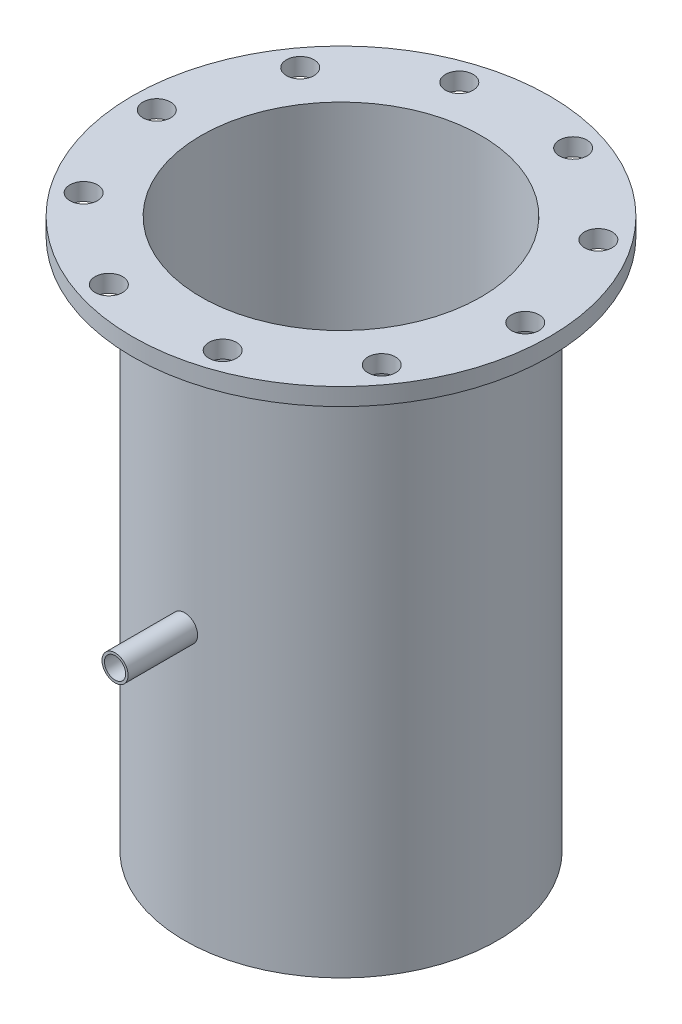
ISO-10303-21;
HEADER;
FILE_DESCRIPTION(('STEP AP214'),'2;1');
FILE_NAME('part.step','',(''),(''),'','','');
FILE_SCHEMA(('AUTOMOTIVE_DESIGN { 1 0 10303 214 1 1 1 1 }'));
ENDSEC;
DATA;
#1=APPLICATION_CONTEXT('core data for automotive mechanical design processes');
#2=APPLICATION_PROTOCOL_DEFINITION('international standard','automotive_design',2000,#1);
#3=PRODUCT_CONTEXT('',#1,'mechanical');
#4=PRODUCT('Part','Part','',(#3));
#5=PRODUCT_RELATED_PRODUCT_CATEGORY('part','',(#4));
#6=PRODUCT_DEFINITION_FORMATION('','',#4);
#7=PRODUCT_DEFINITION_CONTEXT('part definition',#1,'design');
#8=PRODUCT_DEFINITION('design','',#6,#7);
#9=PRODUCT_DEFINITION_SHAPE('','',#8);
#10=(LENGTH_UNIT() NAMED_UNIT(*) SI_UNIT(.MILLI.,.METRE.));
#11=(NAMED_UNIT(*) PLANE_ANGLE_UNIT() SI_UNIT($,.RADIAN.));
#12=(NAMED_UNIT(*) SI_UNIT($,.STERADIAN.) SOLID_ANGLE_UNIT());
#13=UNCERTAINTY_MEASURE_WITH_UNIT(LENGTH_MEASURE(1.E-05),#10,'distance_accuracy_value','');
#14=(GEOMETRIC_REPRESENTATION_CONTEXT(3) GLOBAL_UNCERTAINTY_ASSIGNED_CONTEXT((#13)) GLOBAL_UNIT_ASSIGNED_CONTEXT((#10,
#11,#12)) REPRESENTATION_CONTEXT('',''));
#15=CARTESIAN_POINT('',(0.,0.,0.));
#16=DIRECTION('',(0.,0.,1.));
#17=DIRECTION('',(1.,0.,0.));
#18=AXIS2_PLACEMENT_3D('',#15,#16,#17);
#19=CARTESIAN_POINT('',(0.,-101.6,82.5499999999989));
#20=DIRECTION('',(0.,0.,1.));
#21=DIRECTION('',(1.,0.,0.));
#22=AXIS2_PLACEMENT_3D('',#19,#20,#21);
#23=PLANE('',#22);
#24=CARTESIAN_POINT('',(0.,-101.6,82.5499999999989));
#25=DIRECTION('',(0.,0.,1.));
#26=DIRECTION('',(1.,0.,0.));
#27=AXIS2_PLACEMENT_3D('',#24,#25,#26);
#28=CIRCLE('',#27,4.76249999999999);
#29=CARTESIAN_POINT('',(4.76249999999999,-101.6,82.5499999999989));
#30=VERTEX_POINT('',#29);
#31=EDGE_CURVE('E11',#30,#30,#28,.T.);
#32=ORIENTED_EDGE('',*,*,#31,.T.);
#33=EDGE_LOOP('',(#32));
#34=FACE_BOUND('',#33,.T.);
#35=CARTESIAN_POINT('',(0.,-101.6,82.5499999999989));
#36=DIRECTION('',(0.,0.,1.));
#37=DIRECTION('',(1.,0.,0.));
#38=AXIS2_PLACEMENT_3D('',#35,#36,#37);
#39=CIRCLE('',#38,3.8735);
#40=CARTESIAN_POINT('',(3.8735,-101.6,82.5499999999989));
#41=VERTEX_POINT('',#40);
#42=EDGE_CURVE('E52',#41,#41,#39,.T.);
#43=ORIENTED_EDGE('',*,*,#42,.F.);
#44=EDGE_LOOP('',(#43));
#45=FACE_BOUND('',#44,.T.);
#46=ADVANCED_FACE('F41',(#34,#45),#23,.T.);
#47=CARTESIAN_POINT('',(0.,-101.6,57.1499999999989));
#48=DIRECTION('',(0.,0.,1.));
#49=DIRECTION('',(1.,0.,0.));
#50=AXIS2_PLACEMENT_3D('',#47,#48,#49);
#51=PLANE('',#50);
#52=CARTESIAN_POINT('',(0.,-101.6,57.1499999999989));
#53=DIRECTION('',(0.,0.,1.));
#54=DIRECTION('',(1.,0.,0.));
#55=AXIS2_PLACEMENT_3D('',#52,#53,#54);
#56=CIRCLE('',#55,4.76249999999999);
#57=CARTESIAN_POINT('',(4.76249999999999,-101.6,57.1499999999989));
#58=VERTEX_POINT('',#57);
#59=EDGE_CURVE('E45',#58,#58,#56,.T.);
#60=ORIENTED_EDGE('',*,*,#59,.F.);
#61=EDGE_LOOP('',(#60));
#62=FACE_BOUND('',#61,.T.);
#63=CARTESIAN_POINT('',(0.,-101.6,57.1499999999989));
#64=DIRECTION('',(0.,0.,1.));
#65=DIRECTION('',(1.,0.,0.));
#66=AXIS2_PLACEMENT_3D('',#63,#64,#65);
#67=CIRCLE('',#66,3.8735);
#68=CARTESIAN_POINT('',(3.8735,-101.6,57.1499999999989));
#69=VERTEX_POINT('',#68);
#70=EDGE_CURVE('E54',#69,#69,#67,.T.);
#71=ORIENTED_EDGE('',*,*,#70,.T.);
#72=EDGE_LOOP('',(#71));
#73=FACE_BOUND('',#72,.T.);
#74=ADVANCED_FACE('F64',(#62,#73),#51,.F.);
#75=CARTESIAN_POINT('',(0.,-101.6,82.5499999999989));
#76=DIRECTION('',(0.,0.,-1.));
#77=DIRECTION('',(-1.,0.,0.));
#78=AXIS2_PLACEMENT_3D('',#75,#76,#77);
#79=CYLINDRICAL_SURFACE('',#78,4.76249999999999);
#80=ORIENTED_EDGE('',*,*,#31,.F.);
#81=EDGE_LOOP('',(#80));
#82=FACE_BOUND('',#81,.T.);
#83=ORIENTED_EDGE('',*,*,#59,.T.);
#84=EDGE_LOOP('',(#83));
#85=FACE_BOUND('',#84,.T.);
#86=ADVANCED_FACE('F43',(#82,#85),#79,.T.);
#87=CARTESIAN_POINT('',(0.,-101.6,82.5499999999989));
#88=DIRECTION('',(0.,0.,-1.));
#89=DIRECTION('',(-1.,0.,0.));
#90=AXIS2_PLACEMENT_3D('',#87,#88,#89);
#91=CYLINDRICAL_SURFACE('',#90,3.8735);
#92=ORIENTED_EDGE('',*,*,#42,.T.);
#93=EDGE_LOOP('',(#92));
#94=FACE_BOUND('',#93,.T.);
#95=ORIENTED_EDGE('',*,*,#70,.F.);
#96=EDGE_LOOP('',(#95));
#97=FACE_BOUND('',#96,.T.);
#98=ADVANCED_FACE('F60',(#94,#97),#91,.F.);
#99=CLOSED_SHELL('',(#46,#74,#86,#98));
#100=MANIFOLD_SOLID_BREP('B2',#99);
#101=CARTESIAN_POINT('',(76.2,1.25806636316965E-13,0.));
#102=DIRECTION('',(0.,-1.,0.));
#103=DIRECTION('',(1.,0.,0.));
#104=AXIS2_PLACEMENT_3D('',#101,#102,#103);
#105=PLANE('',#104);
#106=CARTESIAN_POINT('',(20.7999338913784,2.16470374895981E-13,64.0156141118266));
#107=DIRECTION('',(0.,1.,0.));
#108=DIRECTION('',(0.,0.,1.));
#109=AXIS2_PLACEMENT_3D('',#106,#107,#108);
#110=CIRCLE('',#109,5.04189999999997);
#111=CARTESIAN_POINT('',(20.7999338913784,2.16470374895981E-13,69.0575141118265));
#112=VERTEX_POINT('',#111);
#113=EDGE_CURVE('E150',#112,#112,#110,.T.);
#114=ORIENTED_EDGE('',*,*,#113,.F.);
#115=EDGE_LOOP('',(#114));
#116=FACE_BOUND('',#115,.T.);
#117=CARTESIAN_POINT('',(-20.7999338913771,-2.16733220838468E-13,64.015614111827));
#118=DIRECTION('',(0.,1.,0.));
#119=DIRECTION('',(0.,0.,1.));
#120=AXIS2_PLACEMENT_3D('',#117,#118,#119);
#121=CIRCLE('',#120,5.04189999999997);
#122=CARTESIAN_POINT('',(-20.7999338913771,-2.16733220838468E-13,69.0575141118269));
#123=VERTEX_POINT('',#122);
#124=EDGE_CURVE('E147',#123,#123,#121,.T.);
#125=ORIENTED_EDGE('',*,*,#124,.F.);
#126=EDGE_LOOP('',(#125));
#127=FACE_BOUND('',#126,.T.);
#128=CARTESIAN_POINT('',(-54.4549338913774,-5.67202291811973E-13,39.5638253318068));
#129=DIRECTION('',(0.,1.,0.));
#130=DIRECTION('',(0.,0.,1.));
#131=AXIS2_PLACEMENT_3D('',#128,#129,#130);
#132=CIRCLE('',#131,5.04189999999997);
#133=CARTESIAN_POINT('',(-54.4549338913774,-5.67202291811973E-13,44.6057253318068));
#134=VERTEX_POINT('',#133);
#135=EDGE_CURVE('E144',#134,#134,#132,.T.);
#136=ORIENTED_EDGE('',*,*,#135,.F.);
#137=EDGE_LOOP('',(#136));
#138=FACE_BOUND('',#137,.T.);
#139=CARTESIAN_POINT('',(-67.31,-7.01069564918256E-13,0.));
#140=DIRECTION('',(0.,1.,0.));
#141=DIRECTION('',(0.,0.,1.));
#142=AXIS2_PLACEMENT_3D('',#139,#140,#141);
#143=CIRCLE('',#142,5.04189999999997);
#144=CARTESIAN_POINT('',(-67.31,-7.01069564918256E-13,5.04189999999997));
#145=VERTEX_POINT('',#144);
#146=EDGE_CURVE('E140',#145,#145,#143,.T.);
#147=ORIENTED_EDGE('',*,*,#146,.F.);
#148=EDGE_LOOP('',(#147));
#149=FACE_BOUND('',#148,.T.);
#150=CARTESIAN_POINT('',(-54.4549338913779,-5.67202291811979E-13,-39.5638253318061));
#151=DIRECTION('',(0.,1.,0.));
#152=DIRECTION('',(0.,0.,1.));
#153=AXIS2_PLACEMENT_3D('',#150,#151,#152);
#154=CIRCLE('',#153,5.04189999999997);
#155=CARTESIAN_POINT('',(-54.4549338913779,-5.67202291811979E-13,-34.5219253318061));
#156=VERTEX_POINT('',#155);
#157=EDGE_CURVE('E136',#156,#156,#154,.T.);
#158=ORIENTED_EDGE('',*,*,#157,.F.);
#159=EDGE_LOOP('',(#158));
#160=FACE_BOUND('',#159,.T.);
#161=CARTESIAN_POINT('',(-20.799933891378,-2.16733220838477E-13,-64.0156141118267));
#162=DIRECTION('',(0.,1.,0.));
#163=DIRECTION('',(0.,0.,1.));
#164=AXIS2_PLACEMENT_3D('',#161,#162,#163);
#165=CIRCLE('',#164,5.04189999999997);
#166=CARTESIAN_POINT('',(-20.799933891378,-2.16733220838477E-13,-58.9737141118267));
#167=VERTEX_POINT('',#166);
#168=EDGE_CURVE('E135',#167,#167,#165,.T.);
#169=ORIENTED_EDGE('',*,*,#168,.F.);
#170=EDGE_LOOP('',(#169));
#171=FACE_BOUND('',#170,.T.);
#172=CARTESIAN_POINT('',(20.7999338913775,2.16470374895971E-13,-64.0156141118268));
#173=DIRECTION('',(0.,1.,0.));
#174=DIRECTION('',(0.,0.,1.));
#175=AXIS2_PLACEMENT_3D('',#172,#173,#174);
#176=CIRCLE('',#175,5.04189999999997);
#177=CARTESIAN_POINT('',(20.7999338913775,2.16470374895971E-13,-58.9737141118269));
#178=VERTEX_POINT('',#177);
#179=EDGE_CURVE('E183',#178,#178,#176,.T.);
#180=ORIENTED_EDGE('',*,*,#179,.F.);
#181=EDGE_LOOP('',(#180));
#182=FACE_BOUND('',#181,.T.);
#183=CARTESIAN_POINT('',(54.4549338913777,5.66939445869475E-13,-39.5638253318064));
#184=DIRECTION('',(0.,1.,0.));
#185=DIRECTION('',(0.,0.,1.));
#186=AXIS2_PLACEMENT_3D('',#183,#184,#185);
#187=CIRCLE('',#186,5.04189999999997);
#188=CARTESIAN_POINT('',(54.4549338913777,5.66939445869475E-13,-34.5219253318065));
#189=VERTEX_POINT('',#188);
#190=EDGE_CURVE('E131',#189,#189,#187,.T.);
#191=ORIENTED_EDGE('',*,*,#190,.F.);
#192=EDGE_LOOP('',(#191));
#193=FACE_BOUND('',#192,.T.);
#194=CARTESIAN_POINT('',(0.,-5.38710126497475E-13,0.));
#195=DIRECTION('',(0.,1.,0.));
#196=DIRECTION('',(-1.,0.,0.));
#197=AXIS2_PLACEMENT_3D('',#194,#195,#196);
#198=CIRCLE('',#197,51.1302);
#199=CARTESIAN_POINT('',(-51.1302,-1.07115860941797E-12,0.));
#200=VERTEX_POINT('',#199);
#201=EDGE_CURVE('E114',#200,#200,#198,.T.);
#202=ORIENTED_EDGE('',*,*,#201,.F.);
#203=EDGE_LOOP('',(#202));
#204=FACE_BOUND('',#203,.T.);
#205=CARTESIAN_POINT('',(0.,-7.96706356220305E-13,0.));
#206=DIRECTION('',(0.,1.,0.));
#207=DIRECTION('',(-1.,0.,0.));
#208=AXIS2_PLACEMENT_3D('',#205,#206,#207);
#209=CIRCLE('',#208,76.2);
#210=CARTESIAN_POINT('',(-76.2,-1.59022123389616E-12,0.));
#211=VERTEX_POINT('',#210);
#212=EDGE_CURVE('E196',#211,#211,#209,.T.);
#213=ORIENTED_EDGE('',*,*,#212,.T.);
#214=EDGE_LOOP('',(#213));
#215=FACE_BOUND('',#214,.T.);
#216=CARTESIAN_POINT('',(67.31,7.00806718975755E-13,0.));
#217=DIRECTION('',(0.,1.,0.));
#218=DIRECTION('',(0.,0.,1.));
#219=AXIS2_PLACEMENT_3D('',#216,#217,#218);
#220=CIRCLE('',#219,5.04189999999997);
#221=CARTESIAN_POINT('',(67.31,7.00806718975755E-13,5.04189999999997));
#222=VERTEX_POINT('',#221);
#223=EDGE_CURVE('E130',#222,#222,#220,.T.);
#224=ORIENTED_EDGE('',*,*,#223,.F.);
#225=EDGE_LOOP('',(#224));
#226=FACE_BOUND('',#225,.T.);
#227=CARTESIAN_POINT('',(54.4549338913782,5.66939445869481E-13,39.5638253318057));
#228=DIRECTION('',(0.,1.,0.));
#229=DIRECTION('',(0.,0.,1.));
#230=AXIS2_PLACEMENT_3D('',#227,#228,#229);
#231=CIRCLE('',#230,5.04189999999997);
#232=CARTESIAN_POINT('',(54.4549338913782,5.66939445869481E-13,44.6057253318056));
#233=VERTEX_POINT('',#232);
#234=EDGE_CURVE('E151',#233,#233,#231,.T.);
#235=ORIENTED_EDGE('',*,*,#234,.F.);
#236=EDGE_LOOP('',(#235));
#237=FACE_BOUND('',#236,.T.);
#238=ADVANCED_FACE('F103',(#116,#127,#138,#149,#160,#171,#182,#193,#204,#215,#226,#237),#105,.F.);
#239=CARTESIAN_POINT('',(0.,0.,0.));
#240=DIRECTION('',(0.,1.,0.));
#241=DIRECTION('',(-1.,0.,0.));
#242=AXIS2_PLACEMENT_3D('',#239,#240,#241);
#243=CYLINDRICAL_SURFACE('',#242,51.130199999999);
#244=CARTESIAN_POINT('',(1.58749999999999,-101.6,51.1055495596115));
#245=CARTESIAN_POINT('',(1.58749605372862,-101.510852488478,51.1055498921587));
#246=CARTESIAN_POINT('',(1.57996555392892,-101.421640883564,51.1057853260804));
#247=CARTESIAN_POINT('',(1.55003028175047,-101.245676189744,51.1067018478611));
#248=CARTESIAN_POINT('',(1.5276077515903,-101.158926165042,51.107383467754));
#249=CARTESIAN_POINT('',(1.46852877150291,-100.990459281286,51.1091150738185));
#250=CARTESIAN_POINT('',(1.4318792966393,-100.908739978525,51.1101648794548));
#251=CARTESIAN_POINT('',(1.34539680280839,-100.752636458917,51.1125143342721));
#252=CARTESIAN_POINT('',(1.29556699783562,-100.678250459921,51.113813922523));
#253=CARTESIAN_POINT('',(1.18411048682259,-100.538866645646,51.1165172308321));
#254=CARTESIAN_POINT('',(1.12247900180269,-100.473872652343,51.117920992933));
#255=CARTESIAN_POINT('',(0.989177057515653,-100.355149978054,51.12067405245));
#256=CARTESIAN_POINT('',(0.91750619826197,-100.301421746129,51.1220233476932));
#257=CARTESIAN_POINT('',(0.766145327172938,-100.206749406945,51.1245155946959));
#258=CARTESIAN_POINT('',(0.686453847318382,-100.16580764565,51.1256585085739));
#259=CARTESIAN_POINT('',(0.521324338599832,-100.097885685485,51.127608823159));
#260=CARTESIAN_POINT('',(0.435886333590878,-100.070905428663,51.1284162252587));
#261=CARTESIAN_POINT('',(0.261718411794087,-100.031680711347,51.1296042708486));
#262=CARTESIAN_POINT('',(0.172989573202975,-100.019431467643,51.129985052861));
#263=CARTESIAN_POINT('',(-0.00526574700392693,-100.010001750514,51.1302773997544));
#264=CARTESIAN_POINT('',(-0.0947922253123596,-100.012821214636,51.1301889665801));
#265=CARTESIAN_POINT('',(-0.272069092035824,-100.033444843708,51.1295529699845));
#266=CARTESIAN_POINT('',(-0.359820081779188,-100.051243845303,51.1290055647681));
#267=CARTESIAN_POINT('',(-0.531087951950168,-100.101313312668,51.1275134989865));
#268=CARTESIAN_POINT('',(-0.614604822733357,-100.133583811399,51.1265688375163));
#269=CARTESIAN_POINT('',(-0.775050318693275,-100.211686150899,51.1243884526253));
#270=CARTESIAN_POINT('',(-0.851977791667259,-100.257520357162,51.1231526784424));
#271=CARTESIAN_POINT('',(-0.997048161370531,-100.361447286397,51.1205293326661));
#272=CARTESIAN_POINT('',(-1.06519103634375,-100.419540039728,51.1191417606968));
#273=CARTESIAN_POINT('',(-1.19078798578479,-100.54636424766,51.1163704981077));
#274=CARTESIAN_POINT('',(-1.24823753615107,-100.615100182721,51.1149868093736));
#275=CARTESIAN_POINT('',(-1.35078221822835,-100.761243787117,51.1123799007398));
#276=CARTESIAN_POINT('',(-1.39587734786766,-100.838651457907,51.111156680867));
#277=CARTESIAN_POINT('',(-1.47243260822175,-100.999943754457,51.1090086787897));
#278=CARTESIAN_POINT('',(-1.50389259138194,-101.083828450298,51.1080838998149));
#279=CARTESIAN_POINT('',(-1.55228160478309,-101.255692449029,51.1066371899268));
#280=CARTESIAN_POINT('',(-1.56921067742078,-101.343671739972,51.1061152578382));
#281=CARTESIAN_POINT('',(-1.58805176098344,-101.521188145422,51.1055333055862));
#282=CARTESIAN_POINT('',(-1.5899700398832,-101.610724594062,51.1054730926256));
#283=CARTESIAN_POINT('',(-1.57875141778276,-101.78884825912,51.1058208650172));
#284=CARTESIAN_POINT('',(-1.56561453551944,-101.877435476718,51.1062288497868));
#285=CARTESIAN_POINT('',(-1.52466369213267,-102.051128505362,51.1074668501389));
#286=CARTESIAN_POINT('',(-1.49685258022519,-102.136234988788,51.1082967837927));
#287=CARTESIAN_POINT('',(-1.42734562581123,-102.30057132257,51.1102850544506));
#288=CARTESIAN_POINT('',(-1.38564975326158,-102.37980116021,51.1114433921651));
#289=CARTESIAN_POINT('',(-1.28954072430584,-102.530164017684,51.1139583632828));
#290=CARTESIAN_POINT('',(-1.23512334692419,-102.601294338437,51.1153150624459));
#291=CARTESIAN_POINT('',(-1.11512221689244,-102.733411915303,51.1180735831226));
#292=CARTESIAN_POINT('',(-1.04953843403058,-102.794399143973,51.1194754047583));
#293=CARTESIAN_POINT('',(-0.909039334322882,-102.904520247726,51.1221667048981));
#294=CARTESIAN_POINT('',(-0.834120848229026,-102.953650080358,51.1234561449932));
#295=CARTESIAN_POINT('',(-0.677095178534237,-103.038634131618,51.1257767826078));
#296=CARTESIAN_POINT('',(-0.594988011735268,-103.074488381274,51.1268079807307));
#297=CARTESIAN_POINT('',(-0.425930936318287,-103.1318964081,51.128495708924));
#298=CARTESIAN_POINT('',(-0.338981917352745,-103.153452803052,51.1291523075764));
#299=CARTESIAN_POINT('',(-0.162696699934564,-103.181661798515,51.1300170941202));
#300=CARTESIAN_POINT('',(-0.0733605040268985,-103.188314414915,51.1302252824897));
#301=CARTESIAN_POINT('',(0.105122731644984,-103.18652670903,51.1301697848172));
#302=CARTESIAN_POINT('',(0.194269835320703,-103.178092754377,51.1299062978566));
#303=CARTESIAN_POINT('',(0.369882113710063,-103.146384414432,51.128937528672));
#304=CARTESIAN_POINT('',(0.456347283122351,-103.123109999807,51.1282322455747));
#305=CARTESIAN_POINT('',(0.624143605955018,-103.062382327871,51.126459322091));
#306=CARTESIAN_POINT('',(0.705474674789696,-103.024928837027,51.1253916757364));
#307=CARTESIAN_POINT('',(0.860692875619458,-102.936908269695,51.1230143136353));
#308=CARTESIAN_POINT('',(0.934580275055936,-102.886341664578,51.1217046065904));
#309=CARTESIAN_POINT('',(1.07284325419265,-102.77351113087,51.118990123738));
#310=CARTESIAN_POINT('',(1.13721582612366,-102.711243517497,51.1175853180722));
#311=CARTESIAN_POINT('',(1.25461141647335,-102.576766885116,51.1148389445224));
#312=CARTESIAN_POINT('',(1.30763162134043,-102.504555408906,51.113497392379));
#313=CARTESIAN_POINT('',(1.40082707456371,-102.352211472933,51.1110283324334));
#314=CARTESIAN_POINT('',(1.44099381248152,-102.272073810915,51.1099009666464));
#315=CARTESIAN_POINT('',(1.50725594409582,-102.106250594663,51.1079899897447));
#316=CARTESIAN_POINT('',(1.53336811116995,-102.020571790956,51.1072059690755));
#317=CARTESIAN_POINT('',(1.56386273402743,-101.878626767128,51.1062795899935));
#318=CARTESIAN_POINT('',(1.5727155489369,-101.82328181052,51.1060070186828));
#319=CARTESIAN_POINT('',(1.58453542036803,-101.711966331642,51.1056418990796));
#320=CARTESIAN_POINT('',(1.58750247875297,-101.65599580957,51.1055493507301));
#321=CARTESIAN_POINT('',(1.58749999999999,-101.6,51.1055495596115));
#322=B_SPLINE_CURVE_WITH_KNOTS('',3,(#244,#245,#246,#247,#248,#249,#250,#251,#252,#253,#254,
#255,#256,#257,#258,#259,#260,#261,#262,#263,#264,#265,#266,#267,#268,#269,#270,#271,#272,#273,
#274,#275,#276,#277,#278,#279,#280,#281,#282,#283,#284,#285,#286,#287,#288,#289,#290,#291,#292,
#293,#294,#295,#296,#297,#298,#299,#300,#301,#302,#303,#304,#305,#306,#307,#308,#309,#310,#311,
#312,#313,#314,#315,#316,#317,#318,#319,#320,#321),.UNSPECIFIED.,.T.,.F.,(4,2,2,2,2,2,2,2,2,2,2,
2,2,2,2,2,2,2,2,2,2,2,2,2,2,2,2,2,2,2,2,2,2,2,2,2,2,2,4),(0.,0.267238141935344,
0.534795521553107,0.802221890783344,1.06958310870296,1.33705282186923,1.60453319453785,
1.87206261364674,2.13959092225299,2.40703234002272,2.67447264938076,2.94182081145202,
3.20916958245846,3.47656500626083,3.74396109228597,4.01147005162192,4.27897905581593,
4.54649095482282,4.81400207330965,5.08140148268252,5.34880055926427,5.61614773550596,
5.88349549022417,6.15093207672846,6.41836938681861,6.68589774389151,6.95342547569223,
7.22090421252795,7.48838266421557,7.75574824715173,8.02311435855306,8.29048487373466,
8.55784577921173,8.82529102125963,9.0928024699598,9.36049067654418,9.62785869920424,
9.79571779686609,9.96357684138818),.UNSPECIFIED.);
#323=CARTESIAN_POINT('',(1.58749999999999,-101.6,51.1055495596115));
#324=VERTEX_POINT('',#323);
#325=EDGE_CURVE('E158',#324,#324,#322,.T.);
#326=ORIENTED_EDGE('',*,*,#325,.T.);
#327=EDGE_LOOP('',(#326));
#328=FACE_BOUND('',#327,.T.);
#329=CARTESIAN_POINT('',(1.95803402827115E-12,-188.026963516126,0.));
#330=DIRECTION('',(0.,1.,0.));
#331=DIRECTION('',(-1.,0.,0.));
#332=AXIS2_PLACEMENT_3D('',#329,#330,#331);
#333=CIRCLE('',#332,51.1301999999981);
#334=CARTESIAN_POINT('',(-51.1301999999961,-188.026963516127,0.));
#335=VERTEX_POINT('',#334);
#336=EDGE_CURVE('E118',#335,#335,#333,.T.);
#337=ORIENTED_EDGE('',*,*,#336,.F.);
#338=EDGE_LOOP('',(#337));
#339=FACE_BOUND('',#338,.T.);
#340=ORIENTED_EDGE('',*,*,#201,.T.);
#341=EDGE_LOOP('',(#340));
#342=FACE_BOUND('',#341,.T.);
#343=ADVANCED_FACE('F227',(#328,#339,#342),#243,.F.);
#344=CARTESIAN_POINT('',(51.1302,-188.026963516126,0.));
#345=DIRECTION('',(0.,1.,0.));
#346=DIRECTION('',(-1.,0.,0.));
#347=AXIS2_PLACEMENT_3D('',#344,#345,#346);
#348=PLANE('',#347);
#349=CARTESIAN_POINT('',(1.95803402827115E-12,-188.026963516126,0.));
#350=DIRECTION('',(0.,1.,0.));
#351=DIRECTION('',(-1.,0.,0.));
#352=AXIS2_PLACEMENT_3D('',#349,#350,#351);
#353=CIRCLE('',#352,53.8479999999981);
#354=CARTESIAN_POINT('',(-53.8479999999961,-188.026963516127,0.));
#355=VERTEX_POINT('',#354);
#356=EDGE_CURVE('E123',#355,#355,#353,.T.);
#357=ORIENTED_EDGE('',*,*,#356,.F.);
#358=EDGE_LOOP('',(#357));
#359=FACE_BOUND('',#358,.T.);
#360=ORIENTED_EDGE('',*,*,#336,.T.);
#361=EDGE_LOOP('',(#360));
#362=FACE_BOUND('',#361,.T.);
#363=ADVANCED_FACE('F224',(#359,#362),#348,.F.);
#364=CARTESIAN_POINT('',(0.,0.,0.));
#365=DIRECTION('',(0.,1.,0.));
#366=DIRECTION('',(-1.,0.,0.));
#367=AXIS2_PLACEMENT_3D('',#364,#365,#366);
#368=CYLINDRICAL_SURFACE('',#367,53.8479999999981);
#369=CARTESIAN_POINT('',(1.98977462337818E-12,-191.074963516126,0.));
#370=DIRECTION('',(0.,1.,0.));
#371=DIRECTION('',(-1.,0.,0.));
#372=AXIS2_PLACEMENT_3D('',#369,#370,#371);
#373=CIRCLE('',#372,53.847999999998);
#374=CARTESIAN_POINT('',(-53.847999999996,-191.074963516127,0.));
#375=VERTEX_POINT('',#374);
#376=EDGE_CURVE('E217',#375,#375,#373,.T.);
#377=ORIENTED_EDGE('',*,*,#376,.F.);
#378=EDGE_LOOP('',(#377));
#379=FACE_BOUND('',#378,.T.);
#380=ORIENTED_EDGE('',*,*,#356,.T.);
#381=EDGE_LOOP('',(#380));
#382=FACE_BOUND('',#381,.T.);
#383=ADVANCED_FACE('F222',(#379,#382),#368,.F.);
#384=CARTESIAN_POINT('',(53.848,-191.074963516126,0.));
#385=DIRECTION('',(0.,-1.,0.));
#386=DIRECTION('',(1.,0.,0.));
#387=AXIS2_PLACEMENT_3D('',#384,#385,#386);
#388=PLANE('',#387);
#389=CARTESIAN_POINT('',(1.98977462337818E-12,-191.074963516126,0.));
#390=DIRECTION('',(0.,1.,0.));
#391=DIRECTION('',(-1.,0.,0.));
#392=AXIS2_PLACEMENT_3D('',#389,#390,#391);
#393=CIRCLE('',#392,51.130199999998);
#394=CARTESIAN_POINT('',(-51.130199999996,-191.074963516127,0.));
#395=VERTEX_POINT('',#394);
#396=EDGE_CURVE('E214',#395,#395,#393,.T.);
#397=ORIENTED_EDGE('',*,*,#396,.F.);
#398=EDGE_LOOP('',(#397));
#399=FACE_BOUND('',#398,.T.);
#400=ORIENTED_EDGE('',*,*,#376,.T.);
#401=EDGE_LOOP('',(#400));
#402=FACE_BOUND('',#401,.T.);
#403=ADVANCED_FACE('F241',(#399,#402),#388,.F.);
#404=CARTESIAN_POINT('',(0.,0.,0.));
#405=DIRECTION('',(0.,1.,0.));
#406=DIRECTION('',(-1.,0.,0.));
#407=AXIS2_PLACEMENT_3D('',#404,#405,#406);
#408=CYLINDRICAL_SURFACE('',#407,51.130199999998);
#409=CARTESIAN_POINT('',(2.08896398308766E-12,-200.599963516126,0.));
#410=DIRECTION('',(0.,1.,0.));
#411=DIRECTION('',(-1.,0.,0.));
#412=AXIS2_PLACEMENT_3D('',#409,#410,#411);
#413=CIRCLE('',#412,51.1301999999979);
#414=CARTESIAN_POINT('',(-51.1301999999958,-200.599963516127,0.));
#415=VERTEX_POINT('',#414);
#416=EDGE_CURVE('E211',#415,#415,#413,.T.);
#417=ORIENTED_EDGE('',*,*,#416,.F.);
#418=EDGE_LOOP('',(#417));
#419=FACE_BOUND('',#418,.T.);
#420=ORIENTED_EDGE('',*,*,#396,.T.);
#421=EDGE_LOOP('',(#420));
#422=FACE_BOUND('',#421,.T.);
#423=ADVANCED_FACE('F245',(#419,#422),#408,.F.);
#424=CARTESIAN_POINT('',(51.1302,-200.599963516126,0.));
#425=DIRECTION('',(0.,1.,0.));
#426=DIRECTION('',(-1.,0.,0.));
#427=AXIS2_PLACEMENT_3D('',#424,#425,#426);
#428=PLANE('',#427);
#429=CARTESIAN_POINT('',(2.08896398308766E-12,-200.599963516126,0.));
#430=DIRECTION('',(0.,1.,0.));
#431=DIRECTION('',(-1.,0.,0.));
#432=AXIS2_PLACEMENT_3D('',#429,#430,#431);
#433=CIRCLE('',#432,57.1499999999979);
#434=CARTESIAN_POINT('',(-57.1499999999958,-200.599963516127,0.));
#435=VERTEX_POINT('',#434);
#436=EDGE_CURVE('E208',#435,#435,#433,.T.);
#437=ORIENTED_EDGE('',*,*,#436,.F.);
#438=EDGE_LOOP('',(#437));
#439=FACE_BOUND('',#438,.T.);
#440=ORIENTED_EDGE('',*,*,#416,.T.);
#441=EDGE_LOOP('',(#440));
#442=FACE_BOUND('',#441,.T.);
#443=ADVANCED_FACE('F249',(#439,#442),#428,.F.);
#444=CARTESIAN_POINT('',(0.,0.,0.));
#445=DIRECTION('',(0.,1.,0.));
#446=DIRECTION('',(-1.,0.,0.));
#447=AXIS2_PLACEMENT_3D('',#444,#445,#446);
#448=CYLINDRICAL_SURFACE('',#447,57.1499999999989);
#449=CARTESIAN_POINT('',(1.58749999999999,-101.6,57.1279471340419));
#450=CARTESIAN_POINT('',(1.58749605211175,-101.689152114199,57.1279474316997));
#451=CARTESIAN_POINT('',(1.57996477777724,-101.778368434292,57.128158067754));
#452=CARTESIAN_POINT('',(1.55002624968093,-101.954342744377,57.1289780604651));
#453=CARTESIAN_POINT('',(1.52760120702016,-102.04109766515,57.1295878939049));
#454=CARTESIAN_POINT('',(1.4685151605687,-102.209574366095,57.131137146312));
#455=CARTESIAN_POINT('',(1.43186109764306,-102.291298577746,57.1320764045656));
#456=CARTESIAN_POINT('',(1.3453673794669,-102.44741094187,57.1341784653256));
#457=CARTESIAN_POINT('',(1.29553095151814,-102.521800883805,57.1353412130985));
#458=CARTESIAN_POINT('',(1.1840628799189,-102.661186617856,57.1377597968267));
#459=CARTESIAN_POINT('',(1.12242716473918,-102.726179153621,57.1390156648227));
#460=CARTESIAN_POINT('',(0.989117012605628,-102.844897856336,57.1414786515467));
#461=CARTESIAN_POINT('',(0.917442176863669,-102.898623575518,57.1426857683356));
#462=CARTESIAN_POINT('',(0.766077323839181,-102.993287844067,57.144915318081));
#463=CARTESIAN_POINT('',(0.686386161691531,-103.034224563514,57.1459377245994));
#464=CARTESIAN_POINT('',(0.521258984462645,-103.102136824492,57.1476823650718));
#465=CARTESIAN_POINT('',(0.435822990773939,-103.129112418008,57.1484046001434));
#466=CARTESIAN_POINT('',(0.261654822905389,-103.168330026972,57.1494673166232));
#467=CARTESIAN_POINT('',(0.172923510266412,-103.180575865855,57.1498078970967));
#468=CARTESIAN_POINT('',(-0.00533600963123359,-103.189998124708,57.1500692438223));
#469=CARTESIAN_POINT('',(-0.0948642139582852,-103.187174600092,57.1499900116181));
#470=CARTESIAN_POINT('',(-0.27215022771742,-103.166541525401,57.1494207497609));
#471=CARTESIAN_POINT('',(-0.359908518480575,-103.148736107521,57.1489308333799));
#472=CARTESIAN_POINT('',(-0.531189911767372,-103.098651066372,57.1475955512312));
#473=CARTESIAN_POINT('',(-0.614713005671812,-103.066371413647,57.1467501847401));
#474=CARTESIAN_POINT('',(-0.775166350965618,-102.988249467337,57.14479908893));
#475=CARTESIAN_POINT('',(-0.85209567967337,-102.942405279616,57.1436933232535));
#476=CARTESIAN_POINT('',(-0.997167613843295,-102.838457031948,57.1413460531883));
#477=CARTESIAN_POINT('',(-1.06531020259512,-102.780352948684,57.1401045485416));
#478=CARTESIAN_POINT('',(-1.19089843189182,-102.653510878535,57.1376252267919));
#479=CARTESIAN_POINT('',(-1.24834045010227,-102.584769305032,57.1363874110769));
#480=CARTESIAN_POINT('',(-1.35086907445976,-102.438616240437,57.1340554420731));
#481=CARTESIAN_POINT('',(-1.39595567864476,-102.361204747968,57.1329612888072));
#482=CARTESIAN_POINT('',(-1.47249321927563,-102.199907268003,57.1310400454698));
#483=CARTESIAN_POINT('',(-1.50394403992341,-102.116021225531,57.1302129576662));
#484=CARTESIAN_POINT('',(-1.55231490904442,-101.944156800725,57.1289191992328));
#485=CARTESIAN_POINT('',(-1.56923499156878,-101.856178427982,57.1284525277583));
#486=CARTESIAN_POINT('',(-1.58805964098903,-101.67865825475,57.1279323730488));
#487=CARTESIAN_POINT('',(-1.58996922508664,-101.589116986684,57.1278787517535));
#488=CARTESIAN_POINT('',(-1.57873174422918,-101.41098512174,57.1281903832332));
#489=CARTESIAN_POINT('',(-1.5655846941333,-101.322394523924,57.1285556355948));
#490=CARTESIAN_POINT('',(-1.52461129875891,-101.148692775065,57.1296637130646));
#491=CARTESIAN_POINT('',(-1.49678723207342,-101.063581086133,57.1304064795635));
#492=CARTESIAN_POINT('',(-1.42725194456905,-100.899236674478,57.1321858020018));
#493=CARTESIAN_POINT('',(-1.38554070004316,-100.820003961792,57.1332223584428));
#494=CARTESIAN_POINT('',(-1.28940216088666,-100.669643533218,57.1354727451845));
#495=CARTESIAN_POINT('',(-1.23497148675063,-100.598517978857,57.1366866225665));
#496=CARTESIAN_POINT('',(-1.1149441438016,-100.466412577475,57.1391546411726));
#497=CARTESIAN_POINT('',(-1.04934744991446,-100.405432753238,57.1404087824872));
#498=CARTESIAN_POINT('',(-0.908828645119023,-100.295333087782,57.1428163486561));
#499=CARTESIAN_POINT('',(-0.833903998447752,-100.246216482243,57.1439697459781));
#500=CARTESIAN_POINT('',(-0.676869101337222,-100.161259634069,57.1460454112666));
#501=CARTESIAN_POINT('',(-0.5947588658622,-100.125419363787,57.1469676797143));
#502=CARTESIAN_POINT('',(-0.425695814193871,-100.06803822904,57.1484769899983));
#503=CARTESIAN_POINT('',(-0.33874371084156,-100.046495265665,57.1490640810384));
#504=CARTESIAN_POINT('',(-0.162455049027922,-100.018313384018,57.1498370501752));
#505=CARTESIAN_POINT('',(-0.0731184917432113,-100.011674458392,57.1500229284699));
#506=CARTESIAN_POINT('',(0.105370719299731,-100.01348935769,57.1499725211979));
#507=CARTESIAN_POINT('',(0.194523425027754,-100.021938079999,57.149736378358));
#508=CARTESIAN_POINT('',(0.370144519721278,-100.053677962774,57.148868819221));
#509=CARTESIAN_POINT('',(0.45661290335832,-100.076969152702,57.1482374021394));
#510=CARTESIAN_POINT('',(0.624412990162665,-100.137732199333,57.1466504232453));
#511=CARTESIAN_POINT('',(0.705744605357133,-100.175204298825,57.1456948558832));
#512=CARTESIAN_POINT('',(0.860960459673788,-100.263263474453,57.1435672610911));
#513=CARTESIAN_POINT('',(0.934844971278732,-100.3138500705,57.1423952415853));
#514=CARTESIAN_POINT('',(1.07309220000807,-100.426716393747,57.1399664259979));
#515=CARTESIAN_POINT('',(1.13745270695402,-100.488998827545,57.1387096103363));
#516=CARTESIAN_POINT('',(1.25482151619644,-100.623502899139,57.136252756959));
#517=CARTESIAN_POINT('',(1.30782700205327,-100.695726995533,57.135052733387));
#518=CARTESIAN_POINT('',(1.40098890785335,-100.848090232612,57.1328444047671));
#519=CARTESIAN_POINT('',(1.44113729057244,-100.928234283417,57.1318362198003));
#520=CARTESIAN_POINT('',(1.50736211798318,-101.094066149741,57.130127492003));
#521=CARTESIAN_POINT('',(1.53345535585072,-101.179747211838,57.1294265822255));
#522=CARTESIAN_POINT('',(1.56390862135457,-101.321641831665,57.1285989448849));
#523=CARTESIAN_POINT('',(1.57274426965151,-101.376934234637,57.1283555764706));
#524=CARTESIAN_POINT('',(1.58454119684748,-101.488142665183,57.1280295776819));
#525=CARTESIAN_POINT('',(1.58750247722705,-101.544058692598,57.127946947267));
#526=CARTESIAN_POINT('',(1.58749999999999,-101.6,57.1279471340419));
#527=B_SPLINE_CURVE_WITH_KNOTS('',3,(#449,#450,#451,#452,#453,#454,#455,#456,#457,#458,#459,
#460,#461,#462,#463,#464,#465,#466,#467,#468,#469,#470,#471,#472,#473,#474,#475,#476,#477,#478,
#479,#480,#481,#482,#483,#484,#485,#486,#487,#488,#489,#490,#491,#492,#493,#494,#495,#496,#497,
#498,#499,#500,#501,#502,#503,#504,#505,#506,#507,#508,#509,#510,#511,#512,#513,#514,#515,#516,
#517,#518,#519,#520,#521,#522,#523,#524,#525,#526),.UNSPECIFIED.,.T.,.F.,(4,2,2,2,2,2,2,2,2,2,2,
2,2,2,2,2,2,2,2,2,2,2,2,2,2,2,2,2,2,2,2,2,2,2,2,2,2,2,4),(0.,0.267252150547049,
0.534824078570929,0.8022656496446,1.06964180627425,1.33711039209143,1.60458960568858,
1.87210707416104,2.13962354651045,2.40707056400025,2.67451659800839,2.94188889119597,
3.20926172850067,3.47667191906252,3.7440826181693,4.01158367672888,4.27908477776766,
4.54658815044061,4.81409089624818,5.08150422648203,5.34891729280937,5.61628885572309,
5.88366087507336,6.15110401511549,6.41854775572924,6.68606435915281,6.95358040547704,
7.22105717051551,7.48853380356903,7.75591999364439,8.02330671445528,8.29069801331813,
8.55807952502192,8.82552298936276,9.09303271236364,9.36070933591312,9.62806542430726,
9.79576126203259,9.96345705749303),.UNSPECIFIED.);
#528=CARTESIAN_POINT('',(1.58749999999999,-101.6,57.1279471340419));
#529=VERTEX_POINT('',#528);
#530=EDGE_CURVE('E40',#529,#529,#527,.T.);
#531=ORIENTED_EDGE('',*,*,#530,.T.);
#532=EDGE_LOOP('',(#531));
#533=FACE_BOUND('',#532,.T.);
#534=CARTESIAN_POINT('',(0.,-8.89000000000057,0.));
#535=DIRECTION('',(0.,1.,0.));
#536=DIRECTION('',(-1.,0.,0.));
#537=AXIS2_PLACEMENT_3D('',#534,#535,#536);
#538=CIRCLE('',#537,57.1499999999999);
#539=CARTESIAN_POINT('',(-57.1499999999998,-8.89000000000116,0.));
#540=VERTEX_POINT('',#539);
#541=EDGE_CURVE('E205',#540,#540,#538,.T.);
#542=ORIENTED_EDGE('',*,*,#541,.F.);
#543=EDGE_LOOP('',(#542));
#544=FACE_BOUND('',#543,.T.);
#545=ORIENTED_EDGE('',*,*,#436,.T.);
#546=EDGE_LOOP('',(#545));
#547=FACE_BOUND('',#546,.T.);
#548=ADVANCED_FACE('F252',(#533,#544,#547),#448,.T.);
#549=CARTESIAN_POINT('',(0.,-8.89000000000057,0.));
#550=DIRECTION('',(0.,-1.,0.));
#551=DIRECTION('',(1.,0.,0.));
#552=AXIS2_PLACEMENT_3D('',#549,#550,#551);
#553=CONICAL_SURFACE('',#552,57.1499999999999,0.785398163397444);
#554=CARTESIAN_POINT('',(0.,-6.35000000000057,0.));
#555=DIRECTION('',(0.,1.,0.));
#556=DIRECTION('',(-1.,0.,0.));
#557=AXIS2_PLACEMENT_3D('',#554,#555,#556);
#558=CIRCLE('',#557,54.61);
#559=CARTESIAN_POINT('',(-54.6099999999999,-6.35000000000114,0.));
#560=VERTEX_POINT('',#559);
#561=EDGE_CURVE('E202',#560,#560,#558,.T.);
#562=ORIENTED_EDGE('',*,*,#561,.F.);
#563=EDGE_LOOP('',(#562));
#564=FACE_BOUND('',#563,.T.);
#565=ORIENTED_EDGE('',*,*,#541,.T.);
#566=EDGE_LOOP('',(#565));
#567=FACE_BOUND('',#566,.T.);
#568=ADVANCED_FACE('F257',(#564,#567),#553,.T.);
#569=CARTESIAN_POINT('',(54.61,-6.35000000000011,0.));
#570=DIRECTION('',(0.,1.,0.));
#571=DIRECTION('',(-1.,0.,0.));
#572=AXIS2_PLACEMENT_3D('',#569,#570,#571);
#573=PLANE('',#572);
#574=CARTESIAN_POINT('',(54.4549338913782,-6.35000000000012,39.5638253318057));
#575=DIRECTION('',(0.,1.,0.));
#576=DIRECTION('',(-1.,0.,0.));
#577=AXIS2_PLACEMENT_3D('',#574,#575,#576);
#578=CIRCLE('',#577,5.04189999999996);
#579=CARTESIAN_POINT('',(49.4130338913783,-6.35000000000017,39.5638253318057));
#580=VERTEX_POINT('',#579);
#581=EDGE_CURVE('E148',#580,#580,#578,.T.);
#582=ORIENTED_EDGE('',*,*,#581,.T.);
#583=EDGE_LOOP('',(#582));
#584=FACE_BOUND('',#583,.T.);
#585=CARTESIAN_POINT('',(20.7999338913784,-6.35000000000047,64.0156141118266));
#586=DIRECTION('',(0.,1.,0.));
#587=DIRECTION('',(-1.,0.,0.));
#588=AXIS2_PLACEMENT_3D('',#585,#586,#587);
#589=CIRCLE('',#588,5.04189999999996);
#590=CARTESIAN_POINT('',(15.7580338913785,-6.35000000000052,64.0156141118266));
#591=VERTEX_POINT('',#590);
#592=EDGE_CURVE('E155',#591,#591,#589,.T.);
#593=ORIENTED_EDGE('',*,*,#592,.T.);
#594=EDGE_LOOP('',(#593));
#595=FACE_BOUND('',#594,.T.);
#596=CARTESIAN_POINT('',(-20.7999338913771,-6.3500000000009,64.015614111827));
#597=DIRECTION('',(0.,1.,0.));
#598=DIRECTION('',(-1.,0.,0.));
#599=AXIS2_PLACEMENT_3D('',#596,#597,#598);
#600=CIRCLE('',#599,5.04189999999996);
#601=CARTESIAN_POINT('',(-25.8418338913771,-6.35000000000095,64.015614111827));
#602=VERTEX_POINT('',#601);
#603=EDGE_CURVE('E145',#602,#602,#600,.T.);
#604=ORIENTED_EDGE('',*,*,#603,.T.);
#605=EDGE_LOOP('',(#604));
#606=FACE_BOUND('',#605,.T.);
#607=CARTESIAN_POINT('',(-54.4549338913774,-6.35000000000125,39.5638253318068));
#608=DIRECTION('',(0.,1.,0.));
#609=DIRECTION('',(-1.,0.,0.));
#610=AXIS2_PLACEMENT_3D('',#607,#608,#609);
#611=CIRCLE('',#610,5.04189999999996);
#612=CARTESIAN_POINT('',(-59.4968338913773,-6.3500000000013,39.5638253318068));
#613=VERTEX_POINT('',#612);
#614=EDGE_CURVE('E141',#613,#613,#611,.T.);
#615=ORIENTED_EDGE('',*,*,#614,.T.);
#616=EDGE_LOOP('',(#615));
#617=FACE_BOUND('',#616,.T.);
#618=CARTESIAN_POINT('',(-67.31,-6.35000000000138,0.));
#619=DIRECTION('',(0.,1.,0.));
#620=DIRECTION('',(-1.,0.,0.));
#621=AXIS2_PLACEMENT_3D('',#618,#619,#620);
#622=CIRCLE('',#621,5.04189999999996);
#623=CARTESIAN_POINT('',(-72.3519,-6.35000000000144,0.));
#624=VERTEX_POINT('',#623);
#625=EDGE_CURVE('E137',#624,#624,#622,.T.);
#626=ORIENTED_EDGE('',*,*,#625,.T.);
#627=EDGE_LOOP('',(#626));
#628=FACE_BOUND('',#627,.T.);
#629=CARTESIAN_POINT('',(-54.4549338913779,-6.35000000000125,-39.5638253318061));
#630=DIRECTION('',(0.,1.,0.));
#631=DIRECTION('',(-1.,0.,0.));
#632=AXIS2_PLACEMENT_3D('',#629,#630,#631);
#633=CIRCLE('',#632,5.04189999999996);
#634=CARTESIAN_POINT('',(-59.4968338913779,-6.3500000000013,-39.5638253318061));
#635=VERTEX_POINT('',#634);
#636=EDGE_CURVE('E132',#635,#635,#633,.T.);
#637=ORIENTED_EDGE('',*,*,#636,.T.);
#638=EDGE_LOOP('',(#637));
#639=FACE_BOUND('',#638,.T.);
#640=CARTESIAN_POINT('',(-20.799933891378,-6.3500000000009,-64.0156141118267));
#641=DIRECTION('',(0.,1.,0.));
#642=DIRECTION('',(-1.,0.,0.));
#643=AXIS2_PLACEMENT_3D('',#640,#641,#642);
#644=CIRCLE('',#643,5.04189999999996);
#645=CARTESIAN_POINT('',(-25.841833891378,-6.35000000000095,-64.0156141118267));
#646=VERTEX_POINT('',#645);
#647=EDGE_CURVE('E180',#646,#646,#644,.T.);
#648=ORIENTED_EDGE('',*,*,#647,.T.);
#649=EDGE_LOOP('',(#648));
#650=FACE_BOUND('',#649,.T.);
#651=CARTESIAN_POINT('',(20.7999338913775,-6.35000000000047,-64.0156141118268));
#652=DIRECTION('',(0.,1.,0.));
#653=DIRECTION('',(-1.,0.,0.));
#654=AXIS2_PLACEMENT_3D('',#651,#652,#653);
#655=CIRCLE('',#654,5.04189999999996);
#656=CARTESIAN_POINT('',(15.7580338913776,-6.35000000000052,-64.0156141118268));
#657=VERTEX_POINT('',#656);
#658=EDGE_CURVE('E186',#657,#657,#655,.T.);
#659=ORIENTED_EDGE('',*,*,#658,.T.);
#660=EDGE_LOOP('',(#659));
#661=FACE_BOUND('',#660,.T.);
#662=CARTESIAN_POINT('',(54.4549338913777,-6.35000000000012,-39.5638253318064));
#663=DIRECTION('',(0.,1.,0.));
#664=DIRECTION('',(-1.,0.,0.));
#665=AXIS2_PLACEMENT_3D('',#662,#663,#664);
#666=CIRCLE('',#665,5.04189999999996);
#667=CARTESIAN_POINT('',(49.4130338913777,-6.35000000000017,-39.5638253318064));
#668=VERTEX_POINT('',#667);
#669=EDGE_CURVE('E127',#668,#668,#666,.T.);
#670=ORIENTED_EDGE('',*,*,#669,.T.);
#671=EDGE_LOOP('',(#670));
#672=FACE_BOUND('',#671,.T.);
#673=CARTESIAN_POINT('',(67.31,-6.34999999999998,0.));
#674=DIRECTION('',(0.,1.,0.));
#675=DIRECTION('',(-1.,0.,0.));
#676=AXIS2_PLACEMENT_3D('',#673,#674,#675);
#677=CIRCLE('',#676,5.04189999999996);
#678=CARTESIAN_POINT('',(62.2681,-6.35000000000004,0.));
#679=VERTEX_POINT('',#678);
#680=EDGE_CURVE('E193',#679,#679,#677,.T.);
#681=ORIENTED_EDGE('',*,*,#680,.T.);
#682=EDGE_LOOP('',(#681));
#683=FACE_BOUND('',#682,.T.);
#684=CARTESIAN_POINT('',(0.,-6.3500000000008,0.));
#685=DIRECTION('',(0.,1.,0.));
#686=DIRECTION('',(-1.,0.,0.));
#687=AXIS2_PLACEMENT_3D('',#684,#685,#686);
#688=CIRCLE('',#687,76.1999999999999);
#689=CARTESIAN_POINT('',(-76.1999999999999,-6.35000000000159,0.));
#690=VERTEX_POINT('',#689);
#691=EDGE_CURVE('E199',#690,#690,#688,.T.);
#692=ORIENTED_EDGE('',*,*,#691,.F.);
#693=EDGE_LOOP('',(#692));
#694=FACE_BOUND('',#693,.T.);
#695=ORIENTED_EDGE('',*,*,#561,.T.);
#696=EDGE_LOOP('',(#695));
#697=FACE_BOUND('',#696,.T.);
#698=ADVANCED_FACE('F260',(#584,#595,#606,#617,#628,#639,#650,#661,#672,#683,#694,#697),#573,.F.);
#699=CARTESIAN_POINT('',(0.,0.,0.));
#700=DIRECTION('',(0.,1.,0.));
#701=DIRECTION('',(-1.,0.,0.));
#702=AXIS2_PLACEMENT_3D('',#699,#700,#701);
#703=CYLINDRICAL_SURFACE('',#702,76.2);
#704=ORIENTED_EDGE('',*,*,#212,.F.);
#705=EDGE_LOOP('',(#704));
#706=FACE_BOUND('',#705,.T.);
#707=ORIENTED_EDGE('',*,*,#691,.T.);
#708=EDGE_LOOP('',(#707));
#709=FACE_BOUND('',#708,.T.);
#710=ADVANCED_FACE('F264',(#706,#709),#703,.T.);
#711=CARTESIAN_POINT('',(67.31,7.00938141947005E-13,0.));
#712=DIRECTION('',(0.,1.,0.));
#713=DIRECTION('',(0.,0.,1.));
#714=AXIS2_PLACEMENT_3D('',#711,#712,#713);
#715=CYLINDRICAL_SURFACE('',#714,5.04189999999996);
#716=ORIENTED_EDGE('',*,*,#223,.T.);
#717=EDGE_LOOP('',(#716));
#718=FACE_BOUND('',#717,.T.);
#719=ORIENTED_EDGE('',*,*,#680,.F.);
#720=EDGE_LOOP('',(#719));
#721=FACE_BOUND('',#720,.T.);
#722=ADVANCED_FACE('F267',(#718,#721),#715,.F.);
#723=CARTESIAN_POINT('',(54.4549338913777,5.67070868840726E-13,-39.5638253318064));
#724=DIRECTION('',(0.,1.,0.));
#725=DIRECTION('',(0.,0.,1.));
#726=AXIS2_PLACEMENT_3D('',#723,#724,#725);
#727=CYLINDRICAL_SURFACE('',#726,5.04189999999996);
#728=ORIENTED_EDGE('',*,*,#190,.T.);
#729=EDGE_LOOP('',(#728));
#730=FACE_BOUND('',#729,.T.);
#731=ORIENTED_EDGE('',*,*,#669,.F.);
#732=EDGE_LOOP('',(#731));
#733=FACE_BOUND('',#732,.T.);
#734=ADVANCED_FACE('F271',(#730,#733),#727,.F.);
#735=CARTESIAN_POINT('',(20.7999338913775,2.16601797867222E-13,-64.0156141118268));
#736=DIRECTION('',(0.,1.,0.));
#737=DIRECTION('',(0.,0.,1.));
#738=AXIS2_PLACEMENT_3D('',#735,#736,#737);
#739=CYLINDRICAL_SURFACE('',#738,5.04189999999996);
#740=ORIENTED_EDGE('',*,*,#179,.T.);
#741=EDGE_LOOP('',(#740));
#742=FACE_BOUND('',#741,.T.);
#743=ORIENTED_EDGE('',*,*,#658,.F.);
#744=EDGE_LOOP('',(#743));
#745=FACE_BOUND('',#744,.T.);
#746=ADVANCED_FACE('F275',(#742,#745),#739,.F.);
#747=CARTESIAN_POINT('',(-20.799933891378,-2.16601797867227E-13,-64.0156141118267));
#748=DIRECTION('',(0.,1.,0.));
#749=DIRECTION('',(0.,0.,1.));
#750=AXIS2_PLACEMENT_3D('',#747,#748,#749);
#751=CYLINDRICAL_SURFACE('',#750,5.04189999999996);
#752=ORIENTED_EDGE('',*,*,#168,.T.);
#753=EDGE_LOOP('',(#752));
#754=FACE_BOUND('',#753,.T.);
#755=ORIENTED_EDGE('',*,*,#647,.F.);
#756=EDGE_LOOP('',(#755));
#757=FACE_BOUND('',#756,.T.);
#758=ADVANCED_FACE('F279',(#754,#757),#751,.F.);
#759=CARTESIAN_POINT('',(-54.4549338913779,-5.67070868840729E-13,-39.5638253318061));
#760=DIRECTION('',(0.,1.,0.));
#761=DIRECTION('',(0.,0.,1.));
#762=AXIS2_PLACEMENT_3D('',#759,#760,#761);
#763=CYLINDRICAL_SURFACE('',#762,5.04189999999996);
#764=ORIENTED_EDGE('',*,*,#157,.T.);
#765=EDGE_LOOP('',(#764));
#766=FACE_BOUND('',#765,.T.);
#767=ORIENTED_EDGE('',*,*,#636,.F.);
#768=EDGE_LOOP('',(#767));
#769=FACE_BOUND('',#768,.T.);
#770=ADVANCED_FACE('F283',(#766,#769),#763,.F.);
#771=CARTESIAN_POINT('',(-67.31,-7.00938141947005E-13,0.));
#772=DIRECTION('',(0.,1.,0.));
#773=DIRECTION('',(0.,0.,1.));
#774=AXIS2_PLACEMENT_3D('',#771,#772,#773);
#775=CYLINDRICAL_SURFACE('',#774,5.04189999999996);
#776=ORIENTED_EDGE('',*,*,#146,.T.);
#777=EDGE_LOOP('',(#776));
#778=FACE_BOUND('',#777,.T.);
#779=ORIENTED_EDGE('',*,*,#625,.F.);
#780=EDGE_LOOP('',(#779));
#781=FACE_BOUND('',#780,.T.);
#782=ADVANCED_FACE('F287',(#778,#781),#775,.F.);
#783=CARTESIAN_POINT('',(-54.4549338913774,-5.67070868840723E-13,39.5638253318068));
#784=DIRECTION('',(0.,1.,0.));
#785=DIRECTION('',(0.,0.,1.));
#786=AXIS2_PLACEMENT_3D('',#783,#784,#785);
#787=CYLINDRICAL_SURFACE('',#786,5.04189999999996);
#788=ORIENTED_EDGE('',*,*,#135,.T.);
#789=EDGE_LOOP('',(#788));
#790=FACE_BOUND('',#789,.T.);
#791=ORIENTED_EDGE('',*,*,#614,.F.);
#792=EDGE_LOOP('',(#791));
#793=FACE_BOUND('',#792,.T.);
#794=ADVANCED_FACE('F291',(#790,#793),#787,.F.);
#795=CARTESIAN_POINT('',(-20.7999338913771,-2.16601797867217E-13,64.015614111827));
#796=DIRECTION('',(0.,1.,0.));
#797=DIRECTION('',(0.,0.,1.));
#798=AXIS2_PLACEMENT_3D('',#795,#796,#797);
#799=CYLINDRICAL_SURFACE('',#798,5.04189999999996);
#800=ORIENTED_EDGE('',*,*,#124,.T.);
#801=EDGE_LOOP('',(#800));
#802=FACE_BOUND('',#801,.T.);
#803=ORIENTED_EDGE('',*,*,#603,.F.);
#804=EDGE_LOOP('',(#803));
#805=FACE_BOUND('',#804,.T.);
#806=ADVANCED_FACE('F295',(#802,#805),#799,.F.);
#807=CARTESIAN_POINT('',(20.7999338913784,2.16601797867231E-13,64.0156141118266));
#808=DIRECTION('',(0.,1.,0.));
#809=DIRECTION('',(0.,0.,1.));
#810=AXIS2_PLACEMENT_3D('',#807,#808,#809);
#811=CYLINDRICAL_SURFACE('',#810,5.04189999999996);
#812=ORIENTED_EDGE('',*,*,#113,.T.);
#813=EDGE_LOOP('',(#812));
#814=FACE_BOUND('',#813,.T.);
#815=ORIENTED_EDGE('',*,*,#592,.F.);
#816=EDGE_LOOP('',(#815));
#817=FACE_BOUND('',#816,.T.);
#818=ADVANCED_FACE('F299',(#814,#817),#811,.F.);
#819=CARTESIAN_POINT('',(54.4549338913782,5.67070868840732E-13,39.5638253318057));
#820=DIRECTION('',(0.,1.,0.));
#821=DIRECTION('',(0.,0.,1.));
#822=AXIS2_PLACEMENT_3D('',#819,#820,#821);
#823=CYLINDRICAL_SURFACE('',#822,5.04189999999996);
#824=ORIENTED_EDGE('',*,*,#234,.T.);
#825=EDGE_LOOP('',(#824));
#826=FACE_BOUND('',#825,.T.);
#827=ORIENTED_EDGE('',*,*,#581,.F.);
#828=EDGE_LOOP('',(#827));
#829=FACE_BOUND('',#828,.T.);
#830=ADVANCED_FACE('F303',(#826,#829),#823,.F.);
#831=CARTESIAN_POINT('',(0.,-101.6,57.149999999999));
#832=DIRECTION('',(0.,0.,1.));
#833=DIRECTION('',(1.,0.,0.));
#834=AXIS2_PLACEMENT_3D('',#831,#832,#833);
#835=CYLINDRICAL_SURFACE('',#834,1.58749999999999);
#836=ORIENTED_EDGE('',*,*,#530,.F.);
#837=EDGE_LOOP('',(#836));
#838=FACE_BOUND('',#837,.T.);
#839=ORIENTED_EDGE('',*,*,#325,.F.);
#840=EDGE_LOOP('',(#839));
#841=FACE_BOUND('',#840,.T.);
#842=ADVANCED_FACE('F306',(#838,#841),#835,.F.);
#843=CLOSED_SHELL('',(#238,#343,#363,#383,#403,#423,#443,#548,#568,#698,#710,#722,#734,#746,
#758,#770,#782,#794,#806,#818,#830,#842));
#844=MANIFOLD_SOLID_BREP('B6',#843);
#845=ADVANCED_BREP_SHAPE_REPRESENTATION('',(#18,#100,#844),#14);
#846=SHAPE_DEFINITION_REPRESENTATION(#9,#845);
ENDSEC;
END-ISO-10303-21;
